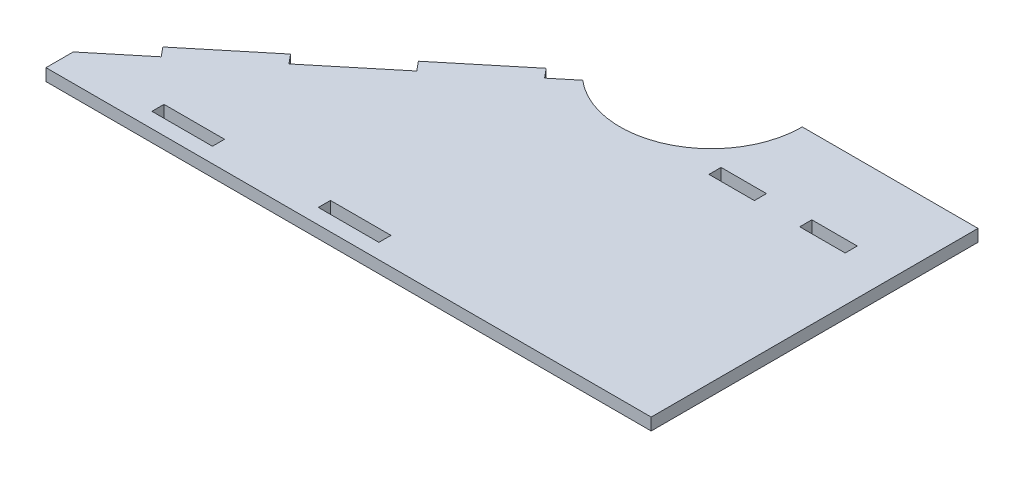
ISO-10303-21;
HEADER;
FILE_DESCRIPTION(('STEP AP214'),'2;1');
FILE_NAME('part.step','',(''),(''),'','','');
FILE_SCHEMA(('AUTOMOTIVE_DESIGN { 1 0 10303 214 1 1 1 1 }'));
ENDSEC;
DATA;
#1=APPLICATION_CONTEXT('core data for automotive mechanical design processes');
#2=APPLICATION_PROTOCOL_DEFINITION('international standard','automotive_design',2000,#1);
#3=PRODUCT_CONTEXT('',#1,'mechanical');
#4=PRODUCT('Part','Part','',(#3));
#5=PRODUCT_RELATED_PRODUCT_CATEGORY('part','',(#4));
#6=PRODUCT_DEFINITION_FORMATION('','',#4);
#7=PRODUCT_DEFINITION_CONTEXT('part definition',#1,'design');
#8=PRODUCT_DEFINITION('design','',#6,#7);
#9=PRODUCT_DEFINITION_SHAPE('','',#8);
#10=(LENGTH_UNIT() NAMED_UNIT(*) SI_UNIT(.MILLI.,.METRE.));
#11=(NAMED_UNIT(*) PLANE_ANGLE_UNIT() SI_UNIT($,.RADIAN.));
#12=(NAMED_UNIT(*) SI_UNIT($,.STERADIAN.) SOLID_ANGLE_UNIT());
#13=UNCERTAINTY_MEASURE_WITH_UNIT(LENGTH_MEASURE(1.E-05),#10,'distance_accuracy_value','');
#14=(GEOMETRIC_REPRESENTATION_CONTEXT(3) GLOBAL_UNCERTAINTY_ASSIGNED_CONTEXT((#13)) GLOBAL_UNIT_ASSIGNED_CONTEXT((#10,
#11,#12)) REPRESENTATION_CONTEXT('',''));
#15=CARTESIAN_POINT('',(0.,0.,0.));
#16=DIRECTION('',(0.,0.,1.));
#17=DIRECTION('',(1.,0.,0.));
#18=AXIS2_PLACEMENT_3D('',#15,#16,#17);
#19=CARTESIAN_POINT('',(120.099257760472,0.,-108.));
#20=DIRECTION('',(0.636069849858945,0.,0.771631483352266));
#21=DIRECTION('',(0.771631483352266,0.,-0.636069849858945));
#22=AXIS2_PLACEMENT_3D('',#19,#20,#21);
#23=PLANE('',#22);
#24=DIRECTION('',(0.,-1.,0.));
#25=VECTOR('',#24,1.);
#26=CARTESIAN_POINT('',(39.0779520084843,4.,-41.2126657648107));
#27=LINE('',#26,#25);
#28=CARTESIAN_POINT('',(39.0779520084843,4.,-41.2126657648107));
#29=VERTEX_POINT('',#28);
#30=CARTESIAN_POINT('',(39.0779520084843,0.,-41.2126657648108));
#31=VERTEX_POINT('',#30);
#32=EDGE_CURVE('E316',#29,#31,#27,.T.);
#33=ORIENTED_EDGE('',*,*,#32,.F.);
#34=DIRECTION('',(0.771631483352266,0.,-0.636069849858945));
#35=VECTOR('',#34,1.);
#36=CARTESIAN_POINT('',(120.099257760472,4.,-108.));
#37=LINE('',#36,#35);
#38=CARTESIAN_POINT('',(62.2268965090523,4.,-60.2947612605791));
#39=VERTEX_POINT('',#38);
#40=EDGE_CURVE('E253',#29,#39,#37,.T.);
#41=ORIENTED_EDGE('',*,*,#40,.T.);
#42=DIRECTION('',(0.,1.,0.));
#43=VECTOR('',#42,1.);
#44=CARTESIAN_POINT('',(62.2268965090523,4.,-60.2947612605791));
#45=LINE('',#44,#43);
#46=CARTESIAN_POINT('',(62.2268965090523,0.,-60.2947612605791));
#47=VERTEX_POINT('',#46);
#48=EDGE_CURVE('E339',#47,#39,#45,.T.);
#49=ORIENTED_EDGE('',*,*,#48,.F.);
#50=DIRECTION('',(0.771631483352266,0.,-0.636069849858945));
#51=VECTOR('',#50,1.);
#52=CARTESIAN_POINT('',(120.099257760472,0.,-108.));
#53=LINE('',#52,#51);
#54=EDGE_CURVE('E248',#31,#47,#53,.T.);
#55=ORIENTED_EDGE('',*,*,#54,.F.);
#56=EDGE_LOOP('',(#33,#41,#49,#55));
#57=FACE_BOUND('',#56,.T.);
#58=ADVANCED_FACE('F33',(#57),#23,.F.);
#59=DIRECTION('',(0.,1.,0.));
#60=VECTOR('',#59,1.);
#61=CARTESIAN_POINT('',(15.9290075079163,4.,-22.1305702690424));
#62=LINE('',#61,#60);
#63=CARTESIAN_POINT('',(15.9290075079163,0.,-22.1305702690424));
#64=VERTEX_POINT('',#63);
#65=CARTESIAN_POINT('',(15.9290075079163,4.,-22.1305702690424));
#66=VERTEX_POINT('',#65);
#67=EDGE_CURVE('E313',#64,#66,#62,.T.);
#68=ORIENTED_EDGE('',*,*,#67,.F.);
#69=CARTESIAN_POINT('',(0.,0.,-9.00000000000001));
#70=VERTEX_POINT('',#69);
#71=EDGE_CURVE('E251',#70,#64,#53,.T.);
#72=ORIENTED_EDGE('',*,*,#71,.F.);
#73=DIRECTION('',(0.,1.,0.));
#74=VECTOR('',#73,1.);
#75=CARTESIAN_POINT('',(0.,0.,-9.00000000000001));
#76=LINE('',#75,#74);
#77=CARTESIAN_POINT('',(0.,4.,-9.00000000000001));
#78=VERTEX_POINT('',#77);
#79=EDGE_CURVE('E257',#70,#78,#76,.T.);
#80=ORIENTED_EDGE('',*,*,#79,.T.);
#81=EDGE_CURVE('E249',#78,#66,#37,.T.);
#82=ORIENTED_EDGE('',*,*,#81,.T.);
#83=EDGE_LOOP('',(#68,#72,#80,#82));
#84=FACE_BOUND('',#83,.T.);
#85=ADVANCED_FACE('F312',(#84),#23,.F.);
#86=CARTESIAN_POINT('',(85.3758410096203,4.,-79.3768567563475));
#87=VERTEX_POINT('',#86);
#88=CARTESIAN_POINT('',(92.286802100105,4.,-85.073687533791));
#89=VERTEX_POINT('',#88);
#90=EDGE_CURVE('E240',#87,#89,#37,.T.);
#91=ORIENTED_EDGE('',*,*,#90,.T.);
#92=DIRECTION('',(0.,1.,0.));
#93=VECTOR('',#92,1.);
#94=CARTESIAN_POINT('',(92.286802100105,0.,-85.073687533791));
#95=LINE('',#94,#93);
#96=CARTESIAN_POINT('',(92.286802100105,0.,-85.073687533791));
#97=VERTEX_POINT('',#96);
#98=EDGE_CURVE('E228',#89,#97,#95,.F.);
#99=ORIENTED_EDGE('',*,*,#98,.T.);
#100=CARTESIAN_POINT('',(85.3758410096203,0.,-79.3768567563475));
#101=VERTEX_POINT('',#100);
#102=EDGE_CURVE('E238',#101,#97,#53,.T.);
#103=ORIENTED_EDGE('',*,*,#102,.F.);
#104=DIRECTION('',(0.,-1.,0.));
#105=VECTOR('',#104,1.);
#106=CARTESIAN_POINT('',(85.3758410096203,4.,-79.3768567563475));
#107=LINE('',#106,#105);
#108=EDGE_CURVE('E334',#87,#101,#107,.T.);
#109=ORIENTED_EDGE('',*,*,#108,.F.);
#110=EDGE_LOOP('',(#91,#99,#103,#109));
#111=FACE_BOUND('',#110,.T.);
#112=ADVANCED_FACE('F236',(#111),#23,.F.);
#113=CARTESIAN_POINT('',(0.,4.,0.));
#114=DIRECTION('',(1.,0.,0.));
#115=DIRECTION('',(0.,0.,-1.));
#116=AXIS2_PLACEMENT_3D('',#113,#114,#115);
#117=PLANE('',#116);
#118=DIRECTION('',(0.,0.,1.));
#119=VECTOR('',#118,1.);
#120=CARTESIAN_POINT('',(0.,4.,0.));
#121=LINE('',#120,#119);
#122=CARTESIAN_POINT('',(0.,4.,0.));
#123=VERTEX_POINT('',#122);
#124=EDGE_CURVE('E268',#78,#123,#121,.T.);
#125=ORIENTED_EDGE('',*,*,#124,.F.);
#126=ORIENTED_EDGE('',*,*,#79,.F.);
#127=DIRECTION('',(0.,0.,1.));
#128=VECTOR('',#127,1.);
#129=CARTESIAN_POINT('',(0.,0.,0.));
#130=LINE('',#129,#128);
#131=CARTESIAN_POINT('',(0.,0.,0.));
#132=VERTEX_POINT('',#131);
#133=EDGE_CURVE('E260',#70,#132,#130,.T.);
#134=ORIENTED_EDGE('',*,*,#133,.T.);
#135=DIRECTION('',(0.,-1.,0.));
#136=VECTOR('',#135,1.);
#137=CARTESIAN_POINT('',(0.,4.,0.));
#138=LINE('',#137,#136);
#139=EDGE_CURVE('E41',#123,#132,#138,.T.);
#140=ORIENTED_EDGE('',*,*,#139,.F.);
#141=EDGE_LOOP('',(#125,#126,#134,#140));
#142=FACE_BOUND('',#141,.T.);
#143=ADVANCED_FACE('F35',(#142),#117,.F.);
#144=CARTESIAN_POINT('',(0.,4.,0.));
#145=DIRECTION('',(0.,0.,-1.));
#146=DIRECTION('',(-1.,0.,0.));
#147=AXIS2_PLACEMENT_3D('',#144,#145,#146);
#148=PLANE('',#147);
#149=DIRECTION('',(1.,0.,0.));
#150=VECTOR('',#149,1.);
#151=CARTESIAN_POINT('',(0.,0.,0.));
#152=LINE('',#151,#150);
#153=CARTESIAN_POINT('',(200.,0.,0.));
#154=VERTEX_POINT('',#153);
#155=EDGE_CURVE('E265',#132,#154,#152,.T.);
#156=ORIENTED_EDGE('',*,*,#155,.T.);
#157=DIRECTION('',(0.,-1.,0.));
#158=VECTOR('',#157,1.);
#159=CARTESIAN_POINT('',(200.,4.,0.));
#160=LINE('',#159,#158);
#161=CARTESIAN_POINT('',(200.,4.,0.));
#162=VERTEX_POINT('',#161);
#163=EDGE_CURVE('E285',#162,#154,#160,.T.);
#164=ORIENTED_EDGE('',*,*,#163,.F.);
#165=DIRECTION('',(1.,0.,0.));
#166=VECTOR('',#165,1.);
#167=CARTESIAN_POINT('',(0.,4.,0.));
#168=LINE('',#167,#166);
#169=EDGE_CURVE('E270',#123,#162,#168,.T.);
#170=ORIENTED_EDGE('',*,*,#169,.F.);
#171=ORIENTED_EDGE('',*,*,#139,.T.);
#172=EDGE_LOOP('',(#156,#164,#170,#171));
#173=FACE_BOUND('',#172,.T.);
#174=ADVANCED_FACE('F291',(#173),#148,.F.);
#175=CARTESIAN_POINT('',(200.,4.,0.));
#176=DIRECTION('',(-1.,0.,0.));
#177=DIRECTION('',(0.,0.,1.));
#178=AXIS2_PLACEMENT_3D('',#175,#176,#177);
#179=PLANE('',#178);
#180=DIRECTION('',(0.,0.,-1.));
#181=VECTOR('',#180,1.);
#182=CARTESIAN_POINT('',(200.,0.,0.));
#183=LINE('',#182,#181);
#184=CARTESIAN_POINT('',(200.,0.,-108.));
#185=VERTEX_POINT('',#184);
#186=EDGE_CURVE('E280',#154,#185,#183,.T.);
#187=ORIENTED_EDGE('',*,*,#186,.T.);
#188=DIRECTION('',(0.,-1.,0.));
#189=VECTOR('',#188,1.);
#190=CARTESIAN_POINT('',(200.,4.,-108.));
#191=LINE('',#190,#189);
#192=CARTESIAN_POINT('',(200.,4.,-108.));
#193=VERTEX_POINT('',#192);
#194=EDGE_CURVE('E277',#193,#185,#191,.T.);
#195=ORIENTED_EDGE('',*,*,#194,.F.);
#196=DIRECTION('',(0.,0.,-1.));
#197=VECTOR('',#196,1.);
#198=CARTESIAN_POINT('',(200.,4.,0.));
#199=LINE('',#198,#197);
#200=EDGE_CURVE('E273',#162,#193,#199,.T.);
#201=ORIENTED_EDGE('',*,*,#200,.F.);
#202=ORIENTED_EDGE('',*,*,#163,.T.);
#203=EDGE_LOOP('',(#187,#195,#201,#202));
#204=FACE_BOUND('',#203,.T.);
#205=ADVANCED_FACE('F299',(#204),#179,.F.);
#206=CARTESIAN_POINT('',(0.,4.,-108.));
#207=DIRECTION('',(0.,0.,1.));
#208=DIRECTION('',(1.,0.,0.));
#209=AXIS2_PLACEMENT_3D('',#206,#207,#208);
#210=PLANE('',#209);
#211=DIRECTION('',(-1.,0.,0.));
#212=VECTOR('',#211,1.);
#213=CARTESIAN_POINT('',(0.,0.,-108.));
#214=LINE('',#213,#212);
#215=CARTESIAN_POINT('',(141.938240273754,0.,-108.));
#216=VERTEX_POINT('',#215);
#217=EDGE_CURVE('E271',#185,#216,#214,.T.);
#218=ORIENTED_EDGE('',*,*,#217,.T.);
#219=DIRECTION('',(0.,1.,0.));
#220=VECTOR('',#219,1.);
#221=CARTESIAN_POINT('',(141.938240273754,0.,-108.));
#222=LINE('',#221,#220);
#223=CARTESIAN_POINT('',(141.938240273754,4.,-108.));
#224=VERTEX_POINT('',#223);
#225=EDGE_CURVE('E47',#216,#224,#222,.T.);
#226=ORIENTED_EDGE('',*,*,#225,.T.);
#227=DIRECTION('',(-1.,0.,0.));
#228=VECTOR('',#227,1.);
#229=CARTESIAN_POINT('',(0.,4.,-108.));
#230=LINE('',#229,#228);
#231=EDGE_CURVE('E275',#193,#224,#230,.T.);
#232=ORIENTED_EDGE('',*,*,#231,.F.);
#233=ORIENTED_EDGE('',*,*,#194,.T.);
#234=EDGE_LOOP('',(#218,#226,#232,#233));
#235=FACE_BOUND('',#234,.T.);
#236=ADVANCED_FACE('F303',(#235),#210,.F.);
#237=CARTESIAN_POINT('',(0.,4.,0.));
#238=DIRECTION('',(0.,-1.,0.));
#239=DIRECTION('',(0.,0.,-1.));
#240=AXIS2_PLACEMENT_3D('',#237,#238,#239);
#241=PLANE('',#240);
#242=DIRECTION('',(-1.,0.,0.));
#243=VECTOR('',#242,1.);
#244=CARTESIAN_POINT('',(185.094068764787,4.,-82.999936793309));
#245=LINE('',#244,#243);
#246=CARTESIAN_POINT('',(185.094068764787,4.,-82.999936793309));
#247=VERTEX_POINT('',#246);
#248=CARTESIAN_POINT('',(170.094068764787,4.,-82.999936793309));
#249=VERTEX_POINT('',#248);
#250=EDGE_CURVE('E491',#247,#249,#245,.T.);
#251=ORIENTED_EDGE('',*,*,#250,.F.);
#252=DIRECTION('',(0.,0.,-1.));
#253=VECTOR('',#252,1.);
#254=CARTESIAN_POINT('',(185.094068764787,4.,-82.999936793309));
#255=LINE('',#254,#253);
#256=CARTESIAN_POINT('',(185.094068764787,4.,-78.999936793309));
#257=VERTEX_POINT('',#256);
#258=EDGE_CURVE('E55',#257,#247,#255,.T.);
#259=ORIENTED_EDGE('',*,*,#258,.F.);
#260=DIRECTION('',(1.,0.,0.));
#261=VECTOR('',#260,1.);
#262=CARTESIAN_POINT('',(185.094068764787,4.,-78.999936793309));
#263=LINE('',#262,#261);
#264=CARTESIAN_POINT('',(170.094068764787,4.,-78.999936793309));
#265=VERTEX_POINT('',#264);
#266=EDGE_CURVE('E484',#265,#257,#263,.T.);
#267=ORIENTED_EDGE('',*,*,#266,.F.);
#268=DIRECTION('',(0.,0.,1.));
#269=VECTOR('',#268,1.);
#270=CARTESIAN_POINT('',(170.094068764787,4.,-82.999936793309));
#271=LINE('',#270,#269);
#272=EDGE_CURVE('E488',#249,#265,#271,.T.);
#273=ORIENTED_EDGE('',*,*,#272,.F.);
#274=EDGE_LOOP('',(#251,#259,#267,#273));
#275=FACE_BOUND('',#274,.T.);
#276=DIRECTION('',(-1.,0.,0.));
#277=VECTOR('',#276,1.);
#278=CARTESIAN_POINT('',(155.094068764787,4.,-82.9999367933088));
#279=LINE('',#278,#277);
#280=CARTESIAN_POINT('',(155.094068764787,4.,-82.9999367933088));
#281=VERTEX_POINT('',#280);
#282=CARTESIAN_POINT('',(140.094068764787,4.,-82.9999367933088));
#283=VERTEX_POINT('',#282);
#284=EDGE_CURVE('E462',#281,#283,#279,.T.);
#285=ORIENTED_EDGE('',*,*,#284,.F.);
#286=DIRECTION('',(0.,0.,-1.));
#287=VECTOR('',#286,1.);
#288=CARTESIAN_POINT('',(155.094068764787,4.,-82.9999367933088));
#289=LINE('',#288,#287);
#290=CARTESIAN_POINT('',(155.094068764787,4.,-78.9999367933088));
#291=VERTEX_POINT('',#290);
#292=EDGE_CURVE('E423',#291,#281,#289,.T.);
#293=ORIENTED_EDGE('',*,*,#292,.F.);
#294=DIRECTION('',(1.,0.,0.));
#295=VECTOR('',#294,1.);
#296=CARTESIAN_POINT('',(155.094068764787,4.,-78.9999367933088));
#297=LINE('',#296,#295);
#298=CARTESIAN_POINT('',(140.094068764787,4.,-78.9999367933088));
#299=VERTEX_POINT('',#298);
#300=EDGE_CURVE('E455',#299,#291,#297,.T.);
#301=ORIENTED_EDGE('',*,*,#300,.F.);
#302=DIRECTION('',(0.,0.,1.));
#303=VECTOR('',#302,1.);
#304=CARTESIAN_POINT('',(140.094068764787,4.,-82.9999367933088));
#305=LINE('',#304,#303);
#306=EDGE_CURVE('E459',#283,#299,#305,.T.);
#307=ORIENTED_EDGE('',*,*,#306,.F.);
#308=EDGE_LOOP('',(#285,#293,#301,#307));
#309=FACE_BOUND('',#308,.T.);
#310=DIRECTION('',(-1.,0.,0.));
#311=VECTOR('',#310,1.);
#312=CARTESIAN_POINT('',(105.,4.,-8.99999999999826));
#313=LINE('',#312,#311);
#314=CARTESIAN_POINT('',(105.,4.,-8.99999999999826));
#315=VERTEX_POINT('',#314);
#316=CARTESIAN_POINT('',(85.,4.,-8.99999999999826));
#317=VERTEX_POINT('',#316);
#318=EDGE_CURVE('E431',#315,#317,#313,.T.);
#319=ORIENTED_EDGE('',*,*,#318,.F.);
#320=DIRECTION('',(0.,0.,-1.));
#321=VECTOR('',#320,1.);
#322=CARTESIAN_POINT('',(105.,4.,-8.99999999999826));
#323=LINE('',#322,#321);
#324=CARTESIAN_POINT('',(105.,4.,-4.99999999999826));
#325=VERTEX_POINT('',#324);
#326=EDGE_CURVE('E391',#325,#315,#323,.T.);
#327=ORIENTED_EDGE('',*,*,#326,.F.);
#328=DIRECTION('',(1.,0.,0.));
#329=VECTOR('',#328,1.);
#330=CARTESIAN_POINT('',(105.,4.,-4.99999999999826));
#331=LINE('',#330,#329);
#332=CARTESIAN_POINT('',(85.,4.,-4.99999999999826));
#333=VERTEX_POINT('',#332);
#334=EDGE_CURVE('E424',#333,#325,#331,.T.);
#335=ORIENTED_EDGE('',*,*,#334,.F.);
#336=DIRECTION('',(0.,0.,1.));
#337=VECTOR('',#336,1.);
#338=CARTESIAN_POINT('',(85.,4.,-8.99999999999826));
#339=LINE('',#338,#337);
#340=EDGE_CURVE('E428',#317,#333,#339,.T.);
#341=ORIENTED_EDGE('',*,*,#340,.F.);
#342=EDGE_LOOP('',(#319,#327,#335,#341));
#343=FACE_BOUND('',#342,.T.);
#344=DIRECTION('',(-1.,0.,0.));
#345=VECTOR('',#344,1.);
#346=CARTESIAN_POINT('',(50.,4.,-8.99999999999787));
#347=LINE('',#346,#345);
#348=CARTESIAN_POINT('',(50.,4.,-8.99999999999787));
#349=VERTEX_POINT('',#348);
#350=CARTESIAN_POINT('',(30.,4.,-8.99999999999787));
#351=VERTEX_POINT('',#350);
#352=EDGE_CURVE('E399',#349,#351,#347,.T.);
#353=ORIENTED_EDGE('',*,*,#352,.F.);
#354=DIRECTION('',(0.,0.,-1.));
#355=VECTOR('',#354,1.);
#356=CARTESIAN_POINT('',(50.,4.,-8.99999999999787));
#357=LINE('',#356,#355);
#358=CARTESIAN_POINT('',(50.,4.,-4.99999999999787));
#359=VERTEX_POINT('',#358);
#360=EDGE_CURVE('E241',#359,#349,#357,.T.);
#361=ORIENTED_EDGE('',*,*,#360,.F.);
#362=DIRECTION('',(1.,0.,0.));
#363=VECTOR('',#362,1.);
#364=CARTESIAN_POINT('',(50.,4.,-4.99999999999787));
#365=LINE('',#364,#363);
#366=CARTESIAN_POINT('',(30.,4.,-4.99999999999787));
#367=VERTEX_POINT('',#366);
#368=EDGE_CURVE('E392',#367,#359,#365,.T.);
#369=ORIENTED_EDGE('',*,*,#368,.F.);
#370=DIRECTION('',(0.,0.,1.));
#371=VECTOR('',#370,1.);
#372=CARTESIAN_POINT('',(30.,4.,-8.99999999999787));
#373=LINE('',#372,#371);
#374=EDGE_CURVE('E396',#351,#367,#373,.T.);
#375=ORIENTED_EDGE('',*,*,#374,.F.);
#376=EDGE_LOOP('',(#353,#361,#369,#375));
#377=FACE_BOUND('',#376,.T.);
#378=ORIENTED_EDGE('',*,*,#231,.T.);
#379=CARTESIAN_POINT('',(111.819464000348,4.,-108.));
#380=DIRECTION('',(0.,1.,0.));
#381=DIRECTION('',(0.,0.,1.));
#382=AXIS2_PLACEMENT_3D('',#379,#380,#381);
#383=CIRCLE('',#382,30.1187762734055);
#384=EDGE_CURVE('E306',#89,#224,#383,.T.);
#385=ORIENTED_EDGE('',*,*,#384,.F.);
#386=ORIENTED_EDGE('',*,*,#90,.F.);
#387=DIRECTION('',(0.636069849858945,0.,0.771631483352266));
#388=VECTOR('',#387,1.);
#389=CARTESIAN_POINT('',(82.8315616101845,4.,-82.4633826897565));
#390=LINE('',#389,#388);
#391=CARTESIAN_POINT('',(82.8315616101845,4.,-82.4633826897565));
#392=VERTEX_POINT('',#391);
#393=EDGE_CURVE('E345',#392,#87,#390,.T.);
#394=ORIENTED_EDGE('',*,*,#393,.F.);
#395=DIRECTION('',(0.771631483352266,0.,-0.636069849858945));
#396=VECTOR('',#395,1.);
#397=CARTESIAN_POINT('',(82.8315616101845,4.,-82.4633826897565));
#398=LINE('',#397,#396);
#399=CARTESIAN_POINT('',(59.6826171096165,4.,-63.3812871939882));
#400=VERTEX_POINT('',#399);
#401=EDGE_CURVE('E343',#400,#392,#398,.T.);
#402=ORIENTED_EDGE('',*,*,#401,.F.);
#403=DIRECTION('',(0.636069849858945,0.,0.771631483352266));
#404=VECTOR('',#403,1.);
#405=CARTESIAN_POINT('',(59.6826171096165,4.,-63.3812871939882));
#406=LINE('',#405,#404);
#407=EDGE_CURVE('E351',#400,#39,#406,.T.);
#408=ORIENTED_EDGE('',*,*,#407,.T.);
#409=ORIENTED_EDGE('',*,*,#40,.F.);
#410=DIRECTION('',(0.636069849858945,0.,0.771631483352266));
#411=VECTOR('',#410,1.);
#412=CARTESIAN_POINT('',(36.5336726090485,4.,-44.2991916982198));
#413=LINE('',#412,#411);
#414=CARTESIAN_POINT('',(36.5336726090485,4.,-44.2991916982198));
#415=VERTEX_POINT('',#414);
#416=EDGE_CURVE('E325',#415,#29,#413,.T.);
#417=ORIENTED_EDGE('',*,*,#416,.F.);
#418=DIRECTION('',(0.771631483352266,0.,-0.636069849858945));
#419=VECTOR('',#418,1.);
#420=CARTESIAN_POINT('',(36.5336726090485,4.,-44.2991916982198));
#421=LINE('',#420,#419);
#422=CARTESIAN_POINT('',(13.3847281084805,4.,-25.2170962024515));
#423=VERTEX_POINT('',#422);
#424=EDGE_CURVE('E327',#423,#415,#421,.T.);
#425=ORIENTED_EDGE('',*,*,#424,.F.);
#426=DIRECTION('',(0.636069849858945,0.,0.771631483352266));
#427=VECTOR('',#426,1.);
#428=CARTESIAN_POINT('',(13.3847281084805,4.,-25.2170962024515));
#429=LINE('',#428,#427);
#430=EDGE_CURVE('E310',#423,#66,#429,.T.);
#431=ORIENTED_EDGE('',*,*,#430,.T.);
#432=ORIENTED_EDGE('',*,*,#81,.F.);
#433=ORIENTED_EDGE('',*,*,#124,.T.);
#434=ORIENTED_EDGE('',*,*,#169,.T.);
#435=ORIENTED_EDGE('',*,*,#200,.T.);
#436=EDGE_LOOP('',(#378,#385,#386,#394,#402,#408,#409,#417,#425,#431,#432,#433,#434,#435));
#437=FACE_BOUND('',#436,.T.);
#438=ADVANCED_FACE('F305',(#275,#309,#343,#377,#437),#241,.F.);
#439=CARTESIAN_POINT('',(0.,0.,0.));
#440=DIRECTION('',(0.,-1.,0.));
#441=DIRECTION('',(0.,0.,-1.));
#442=AXIS2_PLACEMENT_3D('',#439,#440,#441);
#443=PLANE('',#442);
#444=CARTESIAN_POINT('',(111.819464000348,0.,-108.));
#445=DIRECTION('',(0.,-1.,0.));
#446=DIRECTION('',(0.,0.,-1.));
#447=AXIS2_PLACEMENT_3D('',#444,#445,#446);
#448=CIRCLE('',#447,30.1187762734055);
#449=EDGE_CURVE('E11',#216,#97,#448,.T.);
#450=ORIENTED_EDGE('',*,*,#449,.F.);
#451=ORIENTED_EDGE('',*,*,#217,.F.);
#452=ORIENTED_EDGE('',*,*,#186,.F.);
#453=ORIENTED_EDGE('',*,*,#155,.F.);
#454=ORIENTED_EDGE('',*,*,#133,.F.);
#455=ORIENTED_EDGE('',*,*,#71,.T.);
#456=DIRECTION('',(0.636069849858945,0.,0.771631483352266));
#457=VECTOR('',#456,1.);
#458=CARTESIAN_POINT('',(13.3847281084805,0.,-25.2170962024515));
#459=LINE('',#458,#457);
#460=CARTESIAN_POINT('',(13.3847281084805,0.,-25.2170962024515));
#461=VERTEX_POINT('',#460);
#462=EDGE_CURVE('E329',#461,#64,#459,.T.);
#463=ORIENTED_EDGE('',*,*,#462,.F.);
#464=DIRECTION('',(-0.771631483352266,0.,0.636069849858945));
#465=VECTOR('',#464,1.);
#466=CARTESIAN_POINT('',(36.5336726090485,0.,-44.2991916982198));
#467=LINE('',#466,#465);
#468=CARTESIAN_POINT('',(36.5336726090485,0.,-44.2991916982198));
#469=VERTEX_POINT('',#468);
#470=EDGE_CURVE('E319',#469,#461,#467,.T.);
#471=ORIENTED_EDGE('',*,*,#470,.F.);
#472=DIRECTION('',(0.636069849858945,0.,0.771631483352266));
#473=VECTOR('',#472,1.);
#474=CARTESIAN_POINT('',(36.5336726090485,0.,-44.2991916982198));
#475=LINE('',#474,#473);
#476=EDGE_CURVE('E331',#469,#31,#475,.T.);
#477=ORIENTED_EDGE('',*,*,#476,.T.);
#478=ORIENTED_EDGE('',*,*,#54,.T.);
#479=DIRECTION('',(0.636069849858945,0.,0.771631483352266));
#480=VECTOR('',#479,1.);
#481=CARTESIAN_POINT('',(59.6826171096165,0.,-63.3812871939882));
#482=LINE('',#481,#480);
#483=CARTESIAN_POINT('',(59.6826171096165,0.,-63.3812871939882));
#484=VERTEX_POINT('',#483);
#485=EDGE_CURVE('E354',#484,#47,#482,.T.);
#486=ORIENTED_EDGE('',*,*,#485,.F.);
#487=DIRECTION('',(-0.771631483352266,0.,0.636069849858945));
#488=VECTOR('',#487,1.);
#489=CARTESIAN_POINT('',(82.8315616101845,0.,-82.4633826897565));
#490=LINE('',#489,#488);
#491=CARTESIAN_POINT('',(82.8315616101845,0.,-82.4633826897565));
#492=VERTEX_POINT('',#491);
#493=EDGE_CURVE('E338',#492,#484,#490,.T.);
#494=ORIENTED_EDGE('',*,*,#493,.F.);
#495=DIRECTION('',(0.636069849858945,0.,0.771631483352266));
#496=VECTOR('',#495,1.);
#497=CARTESIAN_POINT('',(82.8315616101845,0.,-82.4633826897565));
#498=LINE('',#497,#496);
#499=EDGE_CURVE('E246',#492,#101,#498,.T.);
#500=ORIENTED_EDGE('',*,*,#499,.T.);
#501=ORIENTED_EDGE('',*,*,#102,.T.);
#502=EDGE_LOOP('',(#450,#451,#452,#453,#454,#455,#463,#471,#477,#478,#486,#494,#500,#501));
#503=FACE_BOUND('',#502,.T.);
#504=DIRECTION('',(0.,0.,-1.));
#505=VECTOR('',#504,1.);
#506=CARTESIAN_POINT('',(185.094068764787,0.,-82.999936793309));
#507=LINE('',#506,#505);
#508=CARTESIAN_POINT('',(185.094068764787,0.,-78.999936793309));
#509=VERTEX_POINT('',#508);
#510=CARTESIAN_POINT('',(185.094068764787,0.,-82.999936793309));
#511=VERTEX_POINT('',#510);
#512=EDGE_CURVE('E487',#509,#511,#507,.T.);
#513=ORIENTED_EDGE('',*,*,#512,.T.);
#514=DIRECTION('',(-1.,0.,0.));
#515=VECTOR('',#514,1.);
#516=CARTESIAN_POINT('',(185.094068764787,0.,-82.999936793309));
#517=LINE('',#516,#515);
#518=CARTESIAN_POINT('',(170.094068764787,0.,-82.999936793309));
#519=VERTEX_POINT('',#518);
#520=EDGE_CURVE('E500',#511,#519,#517,.T.);
#521=ORIENTED_EDGE('',*,*,#520,.T.);
#522=DIRECTION('',(0.,0.,1.));
#523=VECTOR('',#522,1.);
#524=CARTESIAN_POINT('',(170.094068764787,0.,-82.999936793309));
#525=LINE('',#524,#523);
#526=CARTESIAN_POINT('',(170.094068764787,0.,-78.999936793309));
#527=VERTEX_POINT('',#526);
#528=EDGE_CURVE('E497',#519,#527,#525,.T.);
#529=ORIENTED_EDGE('',*,*,#528,.T.);
#530=DIRECTION('',(1.,0.,0.));
#531=VECTOR('',#530,1.);
#532=CARTESIAN_POINT('',(185.094068764787,0.,-78.999936793309));
#533=LINE('',#532,#531);
#534=EDGE_CURVE('E479',#527,#509,#533,.T.);
#535=ORIENTED_EDGE('',*,*,#534,.T.);
#536=EDGE_LOOP('',(#513,#521,#529,#535));
#537=FACE_BOUND('',#536,.T.);
#538=DIRECTION('',(0.,0.,-1.));
#539=VECTOR('',#538,1.);
#540=CARTESIAN_POINT('',(155.094068764787,0.,-82.9999367933088));
#541=LINE('',#540,#539);
#542=CARTESIAN_POINT('',(155.094068764787,0.,-78.9999367933088));
#543=VERTEX_POINT('',#542);
#544=CARTESIAN_POINT('',(155.094068764787,0.,-82.9999367933088));
#545=VERTEX_POINT('',#544);
#546=EDGE_CURVE('E458',#543,#545,#541,.T.);
#547=ORIENTED_EDGE('',*,*,#546,.T.);
#548=DIRECTION('',(-1.,0.,0.));
#549=VECTOR('',#548,1.);
#550=CARTESIAN_POINT('',(155.094068764787,0.,-82.9999367933088));
#551=LINE('',#550,#549);
#552=CARTESIAN_POINT('',(140.094068764787,0.,-82.9999367933088));
#553=VERTEX_POINT('',#552);
#554=EDGE_CURVE('E471',#545,#553,#551,.T.);
#555=ORIENTED_EDGE('',*,*,#554,.T.);
#556=DIRECTION('',(0.,0.,1.));
#557=VECTOR('',#556,1.);
#558=CARTESIAN_POINT('',(140.094068764787,0.,-82.9999367933088));
#559=LINE('',#558,#557);
#560=CARTESIAN_POINT('',(140.094068764787,0.,-78.9999367933088));
#561=VERTEX_POINT('',#560);
#562=EDGE_CURVE('E468',#553,#561,#559,.T.);
#563=ORIENTED_EDGE('',*,*,#562,.T.);
#564=DIRECTION('',(1.,0.,0.));
#565=VECTOR('',#564,1.);
#566=CARTESIAN_POINT('',(155.094068764787,0.,-78.9999367933088));
#567=LINE('',#566,#565);
#568=EDGE_CURVE('E449',#561,#543,#567,.T.);
#569=ORIENTED_EDGE('',*,*,#568,.T.);
#570=EDGE_LOOP('',(#547,#555,#563,#569));
#571=FACE_BOUND('',#570,.T.);
#572=DIRECTION('',(0.,0.,-1.));
#573=VECTOR('',#572,1.);
#574=CARTESIAN_POINT('',(105.,0.,-8.99999999999826));
#575=LINE('',#574,#573);
#576=CARTESIAN_POINT('',(105.,0.,-4.99999999999826));
#577=VERTEX_POINT('',#576);
#578=CARTESIAN_POINT('',(105.,0.,-8.99999999999826));
#579=VERTEX_POINT('',#578);
#580=EDGE_CURVE('E427',#577,#579,#575,.T.);
#581=ORIENTED_EDGE('',*,*,#580,.T.);
#582=DIRECTION('',(-1.,0.,0.));
#583=VECTOR('',#582,1.);
#584=CARTESIAN_POINT('',(105.,0.,-8.99999999999826));
#585=LINE('',#584,#583);
#586=CARTESIAN_POINT('',(85.,0.,-8.99999999999826));
#587=VERTEX_POINT('',#586);
#588=EDGE_CURVE('E440',#579,#587,#585,.T.);
#589=ORIENTED_EDGE('',*,*,#588,.T.);
#590=DIRECTION('',(0.,0.,1.));
#591=VECTOR('',#590,1.);
#592=CARTESIAN_POINT('',(85.,0.,-8.99999999999826));
#593=LINE('',#592,#591);
#594=CARTESIAN_POINT('',(85.,0.,-4.99999999999826));
#595=VERTEX_POINT('',#594);
#596=EDGE_CURVE('E437',#587,#595,#593,.T.);
#597=ORIENTED_EDGE('',*,*,#596,.T.);
#598=DIRECTION('',(1.,0.,0.));
#599=VECTOR('',#598,1.);
#600=CARTESIAN_POINT('',(105.,0.,-4.99999999999826));
#601=LINE('',#600,#599);
#602=EDGE_CURVE('E417',#595,#577,#601,.T.);
#603=ORIENTED_EDGE('',*,*,#602,.T.);
#604=EDGE_LOOP('',(#581,#589,#597,#603));
#605=FACE_BOUND('',#604,.T.);
#606=DIRECTION('',(0.,0.,-1.));
#607=VECTOR('',#606,1.);
#608=CARTESIAN_POINT('',(50.,0.,-8.99999999999787));
#609=LINE('',#608,#607);
#610=CARTESIAN_POINT('',(50.,0.,-4.99999999999787));
#611=VERTEX_POINT('',#610);
#612=CARTESIAN_POINT('',(50.,0.,-8.99999999999787));
#613=VERTEX_POINT('',#612);
#614=EDGE_CURVE('E395',#611,#613,#609,.T.);
#615=ORIENTED_EDGE('',*,*,#614,.T.);
#616=DIRECTION('',(-1.,0.,0.));
#617=VECTOR('',#616,1.);
#618=CARTESIAN_POINT('',(50.,0.,-8.99999999999787));
#619=LINE('',#618,#617);
#620=CARTESIAN_POINT('',(30.,0.,-8.99999999999787));
#621=VERTEX_POINT('',#620);
#622=EDGE_CURVE('E408',#613,#621,#619,.T.);
#623=ORIENTED_EDGE('',*,*,#622,.T.);
#624=DIRECTION('',(0.,0.,1.));
#625=VECTOR('',#624,1.);
#626=CARTESIAN_POINT('',(30.,0.,-8.99999999999787));
#627=LINE('',#626,#625);
#628=CARTESIAN_POINT('',(30.,0.,-4.99999999999787));
#629=VERTEX_POINT('',#628);
#630=EDGE_CURVE('E405',#621,#629,#627,.T.);
#631=ORIENTED_EDGE('',*,*,#630,.T.);
#632=DIRECTION('',(1.,0.,0.));
#633=VECTOR('',#632,1.);
#634=CARTESIAN_POINT('',(50.,0.,-4.99999999999787));
#635=LINE('',#634,#633);
#636=EDGE_CURVE('E385',#629,#611,#635,.T.);
#637=ORIENTED_EDGE('',*,*,#636,.T.);
#638=EDGE_LOOP('',(#615,#623,#631,#637));
#639=FACE_BOUND('',#638,.T.);
#640=ADVANCED_FACE('F243',(#503,#537,#571,#605,#639),#443,.T.);
#641=CARTESIAN_POINT('',(82.8315616101845,4.,-82.4633826897565));
#642=DIRECTION('',(-0.771631483352266,0.,0.636069849858945));
#643=DIRECTION('',(0.636069849858945,0.,0.771631483352266));
#644=AXIS2_PLACEMENT_3D('',#641,#642,#643);
#645=PLANE('',#644);
#646=ORIENTED_EDGE('',*,*,#108,.T.);
#647=ORIENTED_EDGE('',*,*,#499,.F.);
#648=DIRECTION('',(0.,-1.,0.));
#649=VECTOR('',#648,1.);
#650=CARTESIAN_POINT('',(82.8315616101845,4.,-82.4633826897565));
#651=LINE('',#650,#649);
#652=EDGE_CURVE('E335',#392,#492,#651,.T.);
#653=ORIENTED_EDGE('',*,*,#652,.F.);
#654=ORIENTED_EDGE('',*,*,#393,.T.);
#655=EDGE_LOOP('',(#646,#647,#653,#654));
#656=FACE_BOUND('',#655,.T.);
#657=ADVANCED_FACE('F551',(#656),#645,.F.);
#658=CARTESIAN_POINT('',(59.6826171096165,4.,-63.3812871939882));
#659=DIRECTION('',(0.771631483352266,0.,-0.636069849858945));
#660=DIRECTION('',(-0.636069849858945,0.,-0.771631483352266));
#661=AXIS2_PLACEMENT_3D('',#658,#659,#660);
#662=PLANE('',#661);
#663=ORIENTED_EDGE('',*,*,#48,.T.);
#664=ORIENTED_EDGE('',*,*,#407,.F.);
#665=DIRECTION('',(0.,1.,0.));
#666=VECTOR('',#665,1.);
#667=CARTESIAN_POINT('',(59.6826171096165,4.,-63.3812871939882));
#668=LINE('',#667,#666);
#669=EDGE_CURVE('E341',#484,#400,#668,.T.);
#670=ORIENTED_EDGE('',*,*,#669,.F.);
#671=ORIENTED_EDGE('',*,*,#485,.T.);
#672=EDGE_LOOP('',(#663,#664,#670,#671));
#673=FACE_BOUND('',#672,.T.);
#674=ADVANCED_FACE('F364',(#673),#662,.F.);
#675=CARTESIAN_POINT('',(-6.96158309529661,0.,-8.44526224831287));
#676=DIRECTION('',(-0.636069849858945,0.,-0.771631483352267));
#677=DIRECTION('',(-0.771631483352266,0.,0.636069849858945));
#678=AXIS2_PLACEMENT_3D('',#675,#676,#677);
#679=PLANE('',#678);
#680=ORIENTED_EDGE('',*,*,#652,.T.);
#681=ORIENTED_EDGE('',*,*,#493,.T.);
#682=ORIENTED_EDGE('',*,*,#669,.T.);
#683=ORIENTED_EDGE('',*,*,#401,.T.);
#684=EDGE_LOOP('',(#680,#681,#682,#683));
#685=FACE_BOUND('',#684,.T.);
#686=ADVANCED_FACE('F371',(#685),#679,.T.);
#687=CARTESIAN_POINT('',(36.5336726090485,4.,-44.2991916982198));
#688=DIRECTION('',(-0.771631483352266,0.,0.636069849858945));
#689=DIRECTION('',(0.636069849858945,0.,0.771631483352266));
#690=AXIS2_PLACEMENT_3D('',#687,#688,#689);
#691=PLANE('',#690);
#692=ORIENTED_EDGE('',*,*,#32,.T.);
#693=ORIENTED_EDGE('',*,*,#476,.F.);
#694=DIRECTION('',(0.,-1.,0.));
#695=VECTOR('',#694,1.);
#696=CARTESIAN_POINT('',(36.5336726090485,4.,-44.2991916982198));
#697=LINE('',#696,#695);
#698=EDGE_CURVE('E315',#415,#469,#697,.T.);
#699=ORIENTED_EDGE('',*,*,#698,.F.);
#700=ORIENTED_EDGE('',*,*,#416,.T.);
#701=EDGE_LOOP('',(#692,#693,#699,#700));
#702=FACE_BOUND('',#701,.T.);
#703=ADVANCED_FACE('F375',(#702),#691,.F.);
#704=CARTESIAN_POINT('',(13.3847281084805,4.,-25.2170962024515));
#705=DIRECTION('',(0.771631483352266,0.,-0.636069849858945));
#706=DIRECTION('',(-0.636069849858945,0.,-0.771631483352266));
#707=AXIS2_PLACEMENT_3D('',#704,#705,#706);
#708=PLANE('',#707);
#709=ORIENTED_EDGE('',*,*,#67,.T.);
#710=ORIENTED_EDGE('',*,*,#430,.F.);
#711=DIRECTION('',(0.,1.,0.));
#712=VECTOR('',#711,1.);
#713=CARTESIAN_POINT('',(13.3847281084805,4.,-25.2170962024515));
#714=LINE('',#713,#712);
#715=EDGE_CURVE('E377',#461,#423,#714,.T.);
#716=ORIENTED_EDGE('',*,*,#715,.F.);
#717=ORIENTED_EDGE('',*,*,#462,.T.);
#718=EDGE_LOOP('',(#709,#710,#716,#717));
#719=FACE_BOUND('',#718,.T.);
#720=ADVANCED_FACE('F720',(#719),#708,.F.);
#721=CARTESIAN_POINT('',(-6.96158309529659,0.,-8.44526224831284));
#722=DIRECTION('',(-0.636069849858945,0.,-0.771631483352266));
#723=DIRECTION('',(-0.771631483352266,0.,0.636069849858945));
#724=AXIS2_PLACEMENT_3D('',#721,#722,#723);
#725=PLANE('',#724);
#726=ORIENTED_EDGE('',*,*,#698,.T.);
#727=ORIENTED_EDGE('',*,*,#470,.T.);
#728=ORIENTED_EDGE('',*,*,#715,.T.);
#729=ORIENTED_EDGE('',*,*,#424,.T.);
#730=EDGE_LOOP('',(#726,#727,#728,#729));
#731=FACE_BOUND('',#730,.T.);
#732=ADVANCED_FACE('F713',(#731),#725,.T.);
#733=CARTESIAN_POINT('',(50.,0.,-8.99999999999787));
#734=DIRECTION('',(1.,0.,0.));
#735=DIRECTION('',(0.,0.,-1.));
#736=AXIS2_PLACEMENT_3D('',#733,#734,#735);
#737=PLANE('',#736);
#738=ORIENTED_EDGE('',*,*,#360,.T.);
#739=DIRECTION('',(0.,1.,0.));
#740=VECTOR('',#739,1.);
#741=CARTESIAN_POINT('',(50.,0.,-8.99999999999787));
#742=LINE('',#741,#740);
#743=EDGE_CURVE('E381',#613,#349,#742,.T.);
#744=ORIENTED_EDGE('',*,*,#743,.F.);
#745=ORIENTED_EDGE('',*,*,#614,.F.);
#746=DIRECTION('',(0.,1.,0.));
#747=VECTOR('',#746,1.);
#748=CARTESIAN_POINT('',(50.,0.,-4.99999999999787));
#749=LINE('',#748,#747);
#750=EDGE_CURVE('E389',#611,#359,#749,.T.);
#751=ORIENTED_EDGE('',*,*,#750,.T.);
#752=EDGE_LOOP('',(#738,#744,#745,#751));
#753=FACE_BOUND('',#752,.T.);
#754=ADVANCED_FACE('F543',(#753),#737,.F.);
#755=CARTESIAN_POINT('',(50.,0.,-4.99999999999787));
#756=DIRECTION('',(0.,0.,1.));
#757=DIRECTION('',(1.,0.,0.));
#758=AXIS2_PLACEMENT_3D('',#755,#756,#757);
#759=PLANE('',#758);
#760=ORIENTED_EDGE('',*,*,#368,.T.);
#761=ORIENTED_EDGE('',*,*,#750,.F.);
#762=ORIENTED_EDGE('',*,*,#636,.F.);
#763=DIRECTION('',(0.,1.,0.));
#764=VECTOR('',#763,1.);
#765=CARTESIAN_POINT('',(30.,0.,-4.99999999999787));
#766=LINE('',#765,#764);
#767=EDGE_CURVE('E387',#629,#367,#766,.T.);
#768=ORIENTED_EDGE('',*,*,#767,.T.);
#769=EDGE_LOOP('',(#760,#761,#762,#768));
#770=FACE_BOUND('',#769,.T.);
#771=ADVANCED_FACE('F546',(#770),#759,.F.);
#772=CARTESIAN_POINT('',(30.,0.,-8.99999999999787));
#773=DIRECTION('',(-1.,0.,0.));
#774=DIRECTION('',(0.,0.,1.));
#775=AXIS2_PLACEMENT_3D('',#772,#773,#774);
#776=PLANE('',#775);
#777=ORIENTED_EDGE('',*,*,#374,.T.);
#778=ORIENTED_EDGE('',*,*,#767,.F.);
#779=ORIENTED_EDGE('',*,*,#630,.F.);
#780=DIRECTION('',(0.,1.,0.));
#781=VECTOR('',#780,1.);
#782=CARTESIAN_POINT('',(30.,0.,-8.99999999999787));
#783=LINE('',#782,#781);
#784=EDGE_CURVE('E384',#621,#351,#783,.T.);
#785=ORIENTED_EDGE('',*,*,#784,.T.);
#786=EDGE_LOOP('',(#777,#778,#779,#785));
#787=FACE_BOUND('',#786,.T.);
#788=ADVANCED_FACE('F548',(#787),#776,.F.);
#789=CARTESIAN_POINT('',(50.,0.,-8.99999999999787));
#790=DIRECTION('',(0.,0.,-1.));
#791=DIRECTION('',(-1.,0.,0.));
#792=AXIS2_PLACEMENT_3D('',#789,#790,#791);
#793=PLANE('',#792);
#794=ORIENTED_EDGE('',*,*,#352,.T.);
#795=ORIENTED_EDGE('',*,*,#784,.F.);
#796=ORIENTED_EDGE('',*,*,#622,.F.);
#797=ORIENTED_EDGE('',*,*,#743,.T.);
#798=EDGE_LOOP('',(#794,#795,#796,#797));
#799=FACE_BOUND('',#798,.T.);
#800=ADVANCED_FACE('F539',(#799),#793,.F.);
#801=CARTESIAN_POINT('',(105.,0.,-8.99999999999826));
#802=DIRECTION('',(1.,0.,0.));
#803=DIRECTION('',(0.,0.,-1.));
#804=AXIS2_PLACEMENT_3D('',#801,#802,#803);
#805=PLANE('',#804);
#806=ORIENTED_EDGE('',*,*,#326,.T.);
#807=DIRECTION('',(0.,1.,0.));
#808=VECTOR('',#807,1.);
#809=CARTESIAN_POINT('',(105.,0.,-8.99999999999826));
#810=LINE('',#809,#808);
#811=EDGE_CURVE('E413',#579,#315,#810,.T.);
#812=ORIENTED_EDGE('',*,*,#811,.F.);
#813=ORIENTED_EDGE('',*,*,#580,.F.);
#814=DIRECTION('',(0.,1.,0.));
#815=VECTOR('',#814,1.);
#816=CARTESIAN_POINT('',(105.,0.,-4.99999999999826));
#817=LINE('',#816,#815);
#818=EDGE_CURVE('E421',#577,#325,#817,.T.);
#819=ORIENTED_EDGE('',*,*,#818,.T.);
#820=EDGE_LOOP('',(#806,#812,#813,#819));
#821=FACE_BOUND('',#820,.T.);
#822=ADVANCED_FACE('F680',(#821),#805,.F.);
#823=CARTESIAN_POINT('',(105.,0.,-4.99999999999826));
#824=DIRECTION('',(0.,0.,1.));
#825=DIRECTION('',(1.,0.,0.));
#826=AXIS2_PLACEMENT_3D('',#823,#824,#825);
#827=PLANE('',#826);
#828=ORIENTED_EDGE('',*,*,#334,.T.);
#829=ORIENTED_EDGE('',*,*,#818,.F.);
#830=ORIENTED_EDGE('',*,*,#602,.F.);
#831=DIRECTION('',(0.,1.,0.));
#832=VECTOR('',#831,1.);
#833=CARTESIAN_POINT('',(85.,0.,-4.99999999999826));
#834=LINE('',#833,#832);
#835=EDGE_CURVE('E419',#595,#333,#834,.T.);
#836=ORIENTED_EDGE('',*,*,#835,.T.);
#837=EDGE_LOOP('',(#828,#829,#830,#836));
#838=FACE_BOUND('',#837,.T.);
#839=ADVANCED_FACE('F672',(#838),#827,.F.);
#840=CARTESIAN_POINT('',(85.,0.,-8.99999999999826));
#841=DIRECTION('',(-1.,0.,0.));
#842=DIRECTION('',(0.,0.,1.));
#843=AXIS2_PLACEMENT_3D('',#840,#841,#842);
#844=PLANE('',#843);
#845=ORIENTED_EDGE('',*,*,#340,.T.);
#846=ORIENTED_EDGE('',*,*,#835,.F.);
#847=ORIENTED_EDGE('',*,*,#596,.F.);
#848=DIRECTION('',(0.,1.,0.));
#849=VECTOR('',#848,1.);
#850=CARTESIAN_POINT('',(85.,0.,-8.99999999999826));
#851=LINE('',#850,#849);
#852=EDGE_CURVE('E416',#587,#317,#851,.T.);
#853=ORIENTED_EDGE('',*,*,#852,.T.);
#854=EDGE_LOOP('',(#845,#846,#847,#853));
#855=FACE_BOUND('',#854,.T.);
#856=ADVANCED_FACE('F664',(#855),#844,.F.);
#857=CARTESIAN_POINT('',(105.,0.,-8.99999999999826));
#858=DIRECTION('',(0.,0.,-1.));
#859=DIRECTION('',(-1.,0.,0.));
#860=AXIS2_PLACEMENT_3D('',#857,#858,#859);
#861=PLANE('',#860);
#862=ORIENTED_EDGE('',*,*,#318,.T.);
#863=ORIENTED_EDGE('',*,*,#852,.F.);
#864=ORIENTED_EDGE('',*,*,#588,.F.);
#865=ORIENTED_EDGE('',*,*,#811,.T.);
#866=EDGE_LOOP('',(#862,#863,#864,#865));
#867=FACE_BOUND('',#866,.T.);
#868=ADVANCED_FACE('F656',(#867),#861,.F.);
#869=CARTESIAN_POINT('',(155.094068764787,0.,-82.9999367933088));
#870=DIRECTION('',(1.,0.,0.));
#871=DIRECTION('',(0.,0.,-1.));
#872=AXIS2_PLACEMENT_3D('',#869,#870,#871);
#873=PLANE('',#872);
#874=ORIENTED_EDGE('',*,*,#292,.T.);
#875=DIRECTION('',(0.,1.,0.));
#876=VECTOR('',#875,1.);
#877=CARTESIAN_POINT('',(155.094068764787,0.,-82.9999367933088));
#878=LINE('',#877,#876);
#879=EDGE_CURVE('E445',#545,#281,#878,.T.);
#880=ORIENTED_EDGE('',*,*,#879,.F.);
#881=ORIENTED_EDGE('',*,*,#546,.F.);
#882=DIRECTION('',(0.,1.,0.));
#883=VECTOR('',#882,1.);
#884=CARTESIAN_POINT('',(155.094068764787,0.,-78.9999367933088));
#885=LINE('',#884,#883);
#886=EDGE_CURVE('E453',#543,#291,#885,.T.);
#887=ORIENTED_EDGE('',*,*,#886,.T.);
#888=EDGE_LOOP('',(#874,#880,#881,#887));
#889=FACE_BOUND('',#888,.T.);
#890=ADVANCED_FACE('F648',(#889),#873,.F.);
#891=CARTESIAN_POINT('',(155.094068764787,0.,-78.9999367933088));
#892=DIRECTION('',(0.,0.,1.));
#893=DIRECTION('',(1.,0.,0.));
#894=AXIS2_PLACEMENT_3D('',#891,#892,#893);
#895=PLANE('',#894);
#896=ORIENTED_EDGE('',*,*,#300,.T.);
#897=ORIENTED_EDGE('',*,*,#886,.F.);
#898=ORIENTED_EDGE('',*,*,#568,.F.);
#899=DIRECTION('',(0.,1.,0.));
#900=VECTOR('',#899,1.);
#901=CARTESIAN_POINT('',(140.094068764787,0.,-78.9999367933088));
#902=LINE('',#901,#900);
#903=EDGE_CURVE('E451',#561,#299,#902,.T.);
#904=ORIENTED_EDGE('',*,*,#903,.T.);
#905=EDGE_LOOP('',(#896,#897,#898,#904));
#906=FACE_BOUND('',#905,.T.);
#907=ADVANCED_FACE('F640',(#906),#895,.F.);
#908=CARTESIAN_POINT('',(140.094068764787,0.,-82.9999367933088));
#909=DIRECTION('',(-1.,0.,0.));
#910=DIRECTION('',(0.,0.,1.));
#911=AXIS2_PLACEMENT_3D('',#908,#909,#910);
#912=PLANE('',#911);
#913=ORIENTED_EDGE('',*,*,#306,.T.);
#914=ORIENTED_EDGE('',*,*,#903,.F.);
#915=ORIENTED_EDGE('',*,*,#562,.F.);
#916=DIRECTION('',(0.,1.,0.));
#917=VECTOR('',#916,1.);
#918=CARTESIAN_POINT('',(140.094068764787,0.,-82.9999367933088));
#919=LINE('',#918,#917);
#920=EDGE_CURVE('E448',#553,#283,#919,.T.);
#921=ORIENTED_EDGE('',*,*,#920,.T.);
#922=EDGE_LOOP('',(#913,#914,#915,#921));
#923=FACE_BOUND('',#922,.T.);
#924=ADVANCED_FACE('F632',(#923),#912,.F.);
#925=CARTESIAN_POINT('',(155.094068764787,0.,-82.9999367933088));
#926=DIRECTION('',(0.,0.,-1.));
#927=DIRECTION('',(-1.,0.,0.));
#928=AXIS2_PLACEMENT_3D('',#925,#926,#927);
#929=PLANE('',#928);
#930=ORIENTED_EDGE('',*,*,#284,.T.);
#931=ORIENTED_EDGE('',*,*,#920,.F.);
#932=ORIENTED_EDGE('',*,*,#554,.F.);
#933=ORIENTED_EDGE('',*,*,#879,.T.);
#934=EDGE_LOOP('',(#930,#931,#932,#933));
#935=FACE_BOUND('',#934,.T.);
#936=ADVANCED_FACE('F625',(#935),#929,.F.);
#937=CARTESIAN_POINT('',(185.094068764787,0.,-82.999936793309));
#938=DIRECTION('',(1.,0.,0.));
#939=DIRECTION('',(0.,0.,-1.));
#940=AXIS2_PLACEMENT_3D('',#937,#938,#939);
#941=PLANE('',#940);
#942=ORIENTED_EDGE('',*,*,#258,.T.);
#943=DIRECTION('',(0.,1.,0.));
#944=VECTOR('',#943,1.);
#945=CARTESIAN_POINT('',(185.094068764787,0.,-82.999936793309));
#946=LINE('',#945,#944);
#947=EDGE_CURVE('E476',#511,#247,#946,.T.);
#948=ORIENTED_EDGE('',*,*,#947,.F.);
#949=ORIENTED_EDGE('',*,*,#512,.F.);
#950=DIRECTION('',(0.,1.,0.));
#951=VECTOR('',#950,1.);
#952=CARTESIAN_POINT('',(185.094068764787,0.,-78.999936793309));
#953=LINE('',#952,#951);
#954=EDGE_CURVE('E321',#509,#257,#953,.T.);
#955=ORIENTED_EDGE('',*,*,#954,.T.);
#956=EDGE_LOOP('',(#942,#948,#949,#955));
#957=FACE_BOUND('',#956,.T.);
#958=ADVANCED_FACE('F510',(#957),#941,.F.);
#959=CARTESIAN_POINT('',(185.094068764787,0.,-78.999936793309));
#960=DIRECTION('',(0.,0.,1.));
#961=DIRECTION('',(1.,0.,0.));
#962=AXIS2_PLACEMENT_3D('',#959,#960,#961);
#963=PLANE('',#962);
#964=ORIENTED_EDGE('',*,*,#266,.T.);
#965=ORIENTED_EDGE('',*,*,#954,.F.);
#966=ORIENTED_EDGE('',*,*,#534,.F.);
#967=DIRECTION('',(0.,1.,0.));
#968=VECTOR('',#967,1.);
#969=CARTESIAN_POINT('',(170.094068764787,0.,-78.999936793309));
#970=LINE('',#969,#968);
#971=EDGE_CURVE('E481',#527,#265,#970,.T.);
#972=ORIENTED_EDGE('',*,*,#971,.T.);
#973=EDGE_LOOP('',(#964,#965,#966,#972));
#974=FACE_BOUND('',#973,.T.);
#975=ADVANCED_FACE('F520',(#974),#963,.F.);
#976=CARTESIAN_POINT('',(170.094068764787,0.,-82.999936793309));
#977=DIRECTION('',(-1.,0.,0.));
#978=DIRECTION('',(0.,0.,1.));
#979=AXIS2_PLACEMENT_3D('',#976,#977,#978);
#980=PLANE('',#979);
#981=ORIENTED_EDGE('',*,*,#272,.T.);
#982=ORIENTED_EDGE('',*,*,#971,.F.);
#983=ORIENTED_EDGE('',*,*,#528,.F.);
#984=DIRECTION('',(0.,1.,0.));
#985=VECTOR('',#984,1.);
#986=CARTESIAN_POINT('',(170.094068764787,0.,-82.999936793309));
#987=LINE('',#986,#985);
#988=EDGE_CURVE('E478',#519,#249,#987,.T.);
#989=ORIENTED_EDGE('',*,*,#988,.T.);
#990=EDGE_LOOP('',(#981,#982,#983,#989));
#991=FACE_BOUND('',#990,.T.);
#992=ADVANCED_FACE('F517',(#991),#980,.F.);
#993=CARTESIAN_POINT('',(185.094068764787,0.,-82.999936793309));
#994=DIRECTION('',(0.,0.,-1.));
#995=DIRECTION('',(-1.,0.,0.));
#996=AXIS2_PLACEMENT_3D('',#993,#994,#995);
#997=PLANE('',#996);
#998=ORIENTED_EDGE('',*,*,#250,.T.);
#999=ORIENTED_EDGE('',*,*,#988,.F.);
#1000=ORIENTED_EDGE('',*,*,#520,.F.);
#1001=ORIENTED_EDGE('',*,*,#947,.T.);
#1002=EDGE_LOOP('',(#998,#999,#1000,#1001));
#1003=FACE_BOUND('',#1002,.T.);
#1004=ADVANCED_FACE('F514',(#1003),#997,.F.);
#1005=CARTESIAN_POINT('',(111.819464000348,0.,-108.));
#1006=DIRECTION('',(0.,1.,0.));
#1007=DIRECTION('',(0.,0.,1.));
#1008=AXIS2_PLACEMENT_3D('',#1005,#1006,#1007);
#1009=CYLINDRICAL_SURFACE('',#1008,30.1187762734055);
#1010=ORIENTED_EDGE('',*,*,#384,.T.);
#1011=ORIENTED_EDGE('',*,*,#225,.F.);
#1012=ORIENTED_EDGE('',*,*,#449,.T.);
#1013=ORIENTED_EDGE('',*,*,#98,.F.);
#1014=EDGE_LOOP('',(#1010,#1011,#1012,#1013));
#1015=FACE_BOUND('',#1014,.T.);
#1016=ADVANCED_FACE('F227',(#1015),#1009,.F.);
#1017=CLOSED_SHELL('',(#58,#85,#112,#143,#174,#205,#236,#438,#640,#657,#674,#686,#703,#720,#732,
#754,#771,#788,#800,#822,#839,#856,#868,#890,#907,#924,#936,#958,#975,#992,#1004,#1016));
#1018=MANIFOLD_SOLID_BREP('B2',#1017);
#1019=ADVANCED_BREP_SHAPE_REPRESENTATION('',(#18,#1018),#14);
#1020=SHAPE_DEFINITION_REPRESENTATION(#9,#1019);
ENDSEC;
END-ISO-10303-21;
